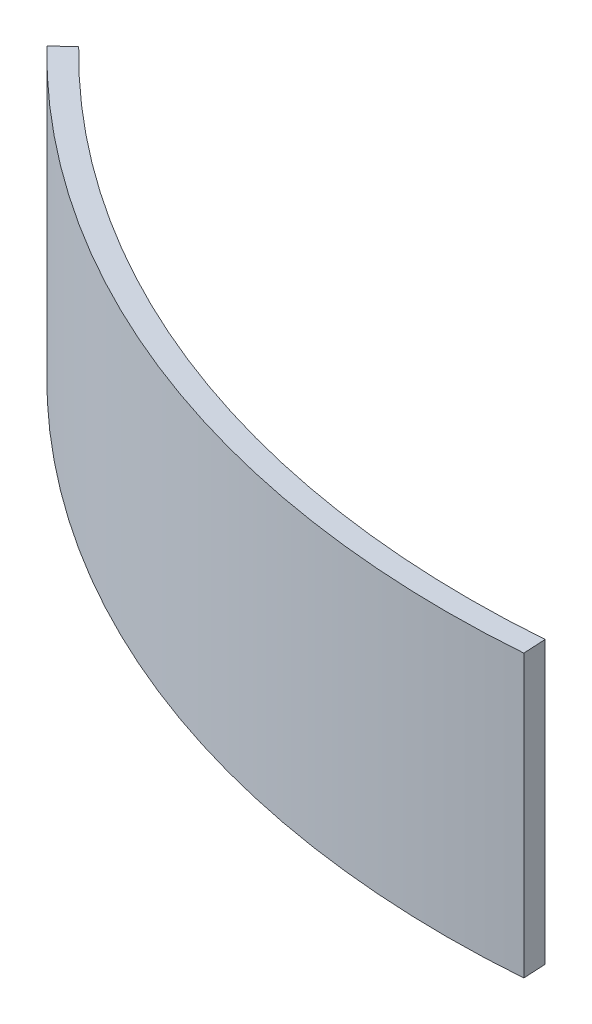
ISO-10303-21;
HEADER;
FILE_DESCRIPTION(('STEP AP214'),'2;1');
FILE_NAME('part.step','',(''),(''),'','','');
FILE_SCHEMA(('AUTOMOTIVE_DESIGN { 1 0 10303 214 1 1 1 1 }'));
ENDSEC;
DATA;
#1=APPLICATION_CONTEXT('core data for automotive mechanical design processes');
#2=APPLICATION_PROTOCOL_DEFINITION('international standard','automotive_design',2000,#1);
#3=PRODUCT_CONTEXT('',#1,'mechanical');
#4=PRODUCT('Part','Part','',(#3));
#5=PRODUCT_RELATED_PRODUCT_CATEGORY('part','',(#4));
#6=PRODUCT_DEFINITION_FORMATION('','',#4);
#7=PRODUCT_DEFINITION_CONTEXT('part definition',#1,'design');
#8=PRODUCT_DEFINITION('design','',#6,#7);
#9=PRODUCT_DEFINITION_SHAPE('','',#8);
#10=(LENGTH_UNIT() NAMED_UNIT(*) SI_UNIT(.MILLI.,.METRE.));
#11=(NAMED_UNIT(*) PLANE_ANGLE_UNIT() SI_UNIT($,.RADIAN.));
#12=(NAMED_UNIT(*) SI_UNIT($,.STERADIAN.) SOLID_ANGLE_UNIT());
#13=UNCERTAINTY_MEASURE_WITH_UNIT(LENGTH_MEASURE(1.E-05),#10,'distance_accuracy_value','');
#14=(GEOMETRIC_REPRESENTATION_CONTEXT(3) GLOBAL_UNCERTAINTY_ASSIGNED_CONTEXT((#13)) GLOBAL_UNIT_ASSIGNED_CONTEXT((#10,
#11,#12)) REPRESENTATION_CONTEXT('',''));
#15=CARTESIAN_POINT('',(0.,0.,0.));
#16=DIRECTION('',(0.,0.,1.));
#17=DIRECTION('',(1.,0.,0.));
#18=AXIS2_PLACEMENT_3D('',#15,#16,#17);
#19=CARTESIAN_POINT('',(4.62050479890785,0.,-0.230351268787765));
#20=DIRECTION('',(0.998547212890272,0.,-0.0538837974633326));
#21=DIRECTION('',(-0.0538837974633327,0.,-0.998547212890272));
#22=AXIS2_PLACEMENT_3D('',#19,#20,#21);
#23=PLANE('',#22);
#24=DIRECTION('',(0.,-1.,0.));
#25=VECTOR('',#24,1.);
#26=CARTESIAN_POINT('',(4.62050479890785,0.,-0.230351268787765));
#27=LINE('',#26,#25);
#28=CARTESIAN_POINT('',(4.62050479890786,0.,-0.230351268787762));
#29=VERTEX_POINT('',#28);
#30=CARTESIAN_POINT('',(4.62050479890786,-25.,-0.230351268787771));
#31=VERTEX_POINT('',#30);
#32=EDGE_CURVE('E95',#29,#31,#27,.T.);
#33=ORIENTED_EDGE('',*,*,#32,.T.);
#34=DIRECTION('',(-0.0538837974633327,0.,-0.998547212890272));
#35=VECTOR('',#34,1.);
#36=CARTESIAN_POINT('',(4.62050479890785,-25.,-0.230351268787768));
#37=LINE('',#36,#35);
#38=CARTESIAN_POINT('',(4.51273720398119,-25.,-2.22744569456831));
#39=VERTEX_POINT('',#38);
#40=EDGE_CURVE('E88',#31,#39,#37,.T.);
#41=ORIENTED_EDGE('',*,*,#40,.T.);
#42=DIRECTION('',(0.,1.,0.));
#43=VECTOR('',#42,1.);
#44=CARTESIAN_POINT('',(4.51273720398119,0.,-2.22744569456831));
#45=LINE('',#44,#43);
#46=CARTESIAN_POINT('',(4.51273720398119,0.,-2.22744569456831));
#47=VERTEX_POINT('',#46);
#48=EDGE_CURVE('E83',#39,#47,#45,.T.);
#49=ORIENTED_EDGE('',*,*,#48,.T.);
#50=DIRECTION('',(0.0538837974633327,0.,0.998547212890272));
#51=VECTOR('',#50,1.);
#52=CARTESIAN_POINT('',(4.62050479890785,0.,-0.230351268787765));
#53=LINE('',#52,#51);
#54=EDGE_CURVE('E78',#47,#29,#53,.T.);
#55=ORIENTED_EDGE('',*,*,#54,.T.);
#56=EDGE_LOOP('',(#33,#41,#49,#55));
#57=FACE_BOUND('',#56,.T.);
#58=ADVANCED_FACE('F43',(#57),#23,.T.);
#59=CARTESIAN_POINT('',(-63.2826344155405,0.,-25.7555279200355));
#60=DIRECTION('',(0.683131159753826,0.,0.730295706254249));
#61=DIRECTION('',(0.730295706254249,0.,-0.683131159753826));
#62=AXIS2_PLACEMENT_3D('',#59,#60,#61);
#63=PLANE('',#62);
#64=DIRECTION('',(0.,-1.,0.));
#65=VECTOR('',#64,1.);
#66=CARTESIAN_POINT('',(-63.2826344155405,0.,-25.7555279200355));
#67=LINE('',#66,#65);
#68=CARTESIAN_POINT('',(-63.2826344155405,0.,-25.7555279200355));
#69=VERTEX_POINT('',#68);
#70=CARTESIAN_POINT('',(-63.2826344155405,-25.,-25.7555279200355));
#71=VERTEX_POINT('',#70);
#72=EDGE_CURVE('E116',#69,#71,#67,.T.);
#73=ORIENTED_EDGE('',*,*,#72,.F.);
#74=DIRECTION('',(-0.730295706254249,0.,0.683131159753826));
#75=VECTOR('',#74,1.);
#76=CARTESIAN_POINT('',(-63.2826344155405,0.,-25.7555279200355));
#77=LINE('',#76,#75);
#78=CARTESIAN_POINT('',(-61.8220430030321,0.,-27.1217902395432));
#79=VERTEX_POINT('',#78);
#80=EDGE_CURVE('E11',#79,#69,#77,.T.);
#81=ORIENTED_EDGE('',*,*,#80,.F.);
#82=DIRECTION('',(0.,1.,0.));
#83=VECTOR('',#82,1.);
#84=CARTESIAN_POINT('',(-61.8220430030321,0.,-27.1217902395432));
#85=LINE('',#84,#83);
#86=CARTESIAN_POINT('',(-61.8220430030321,-25.,-27.1217902395432));
#87=VERTEX_POINT('',#86);
#88=EDGE_CURVE('E51',#87,#79,#85,.T.);
#89=ORIENTED_EDGE('',*,*,#88,.F.);
#90=DIRECTION('',(0.730295706254249,0.,-0.683131159753826));
#91=VECTOR('',#90,1.);
#92=CARTESIAN_POINT('',(-63.2826344155405,-25.,-25.7555279200355));
#93=LINE('',#92,#91);
#94=EDGE_CURVE('E66',#71,#87,#93,.T.);
#95=ORIENTED_EDGE('',*,*,#94,.F.);
#96=EDGE_LOOP('',(#73,#81,#89,#95));
#97=FACE_BOUND('',#96,.T.);
#98=ADVANCED_FACE('F127',(#97),#63,.F.);
#99=CARTESIAN_POINT('',(-1.96160582040153,0.,-85.8023155792657));
#100=DIRECTION('',(0.,-1.,0.));
#101=DIRECTION('',(0.,0.,-1.));
#102=AXIS2_PLACEMENT_3D('',#99,#100,#101);
#103=CYLINDRICAL_SURFACE('',#102,85.8247356894184);
#104=CARTESIAN_POINT('',(-1.96160582040153,-25.,-85.8023155792657));
#105=DIRECTION('',(0.,-1.,0.));
#106=DIRECTION('',(0.0766924659474473,0.,0.997054795719322));
#107=AXIS2_PLACEMENT_3D('',#104,#105,#106);
#108=CIRCLE('',#107,85.8247356894184);
#109=EDGE_CURVE('E98',#31,#71,#108,.T.);
#110=ORIENTED_EDGE('',*,*,#109,.F.);
#111=ORIENTED_EDGE('',*,*,#32,.F.);
#112=CARTESIAN_POINT('',(-1.96160582040153,0.,-85.8023155792657));
#113=DIRECTION('',(0.,-1.,0.));
#114=DIRECTION('',(0.0766924659474473,0.,0.997054795719322));
#115=AXIS2_PLACEMENT_3D('',#112,#113,#114);
#116=CIRCLE('',#115,85.8247356894184);
#117=EDGE_CURVE('E97',#29,#69,#116,.T.);
#118=ORIENTED_EDGE('',*,*,#117,.T.);
#119=ORIENTED_EDGE('',*,*,#72,.T.);
#120=EDGE_LOOP('',(#110,#111,#118,#119));
#121=FACE_BOUND('',#120,.T.);
#122=ADVANCED_FACE('F96',(#121),#103,.T.);
#123=CARTESIAN_POINT('',(4.62050479890785,-25.,-0.230351268787768));
#124=DIRECTION('',(0.,1.,0.));
#125=DIRECTION('',(0.,0.,1.));
#126=AXIS2_PLACEMENT_3D('',#123,#124,#125);
#127=PLANE('',#126);
#128=CARTESIAN_POINT('',(-1.96160582040153,-25.,-85.8023155792657));
#129=DIRECTION('',(0.,-1.,0.));
#130=DIRECTION('',(0.0772361720613266,0.,0.997012825256181));
#131=AXIS2_PLACEMENT_3D('',#128,#129,#130);
#132=CIRCLE('',#131,83.8252706159752);
#133=EDGE_CURVE('E108',#39,#87,#132,.T.);
#134=ORIENTED_EDGE('',*,*,#133,.F.);
#135=ORIENTED_EDGE('',*,*,#40,.F.);
#136=ORIENTED_EDGE('',*,*,#109,.T.);
#137=ORIENTED_EDGE('',*,*,#94,.T.);
#138=EDGE_LOOP('',(#134,#135,#136,#137));
#139=FACE_BOUND('',#138,.T.);
#140=ADVANCED_FACE('F128',(#139),#127,.F.);
#141=CARTESIAN_POINT('',(-1.96160582040153,0.,-85.8023155792657));
#142=DIRECTION('',(0.,-1.,0.));
#143=DIRECTION('',(0.,0.,-1.));
#144=AXIS2_PLACEMENT_3D('',#141,#142,#143);
#145=CYLINDRICAL_SURFACE('',#144,83.8252706159752);
#146=CARTESIAN_POINT('',(-1.96160582040153,0.,-85.8023155792657));
#147=DIRECTION('',(0.,-1.,0.));
#148=DIRECTION('',(0.0772361720613266,0.,0.997012825256181));
#149=AXIS2_PLACEMENT_3D('',#146,#147,#148);
#150=CIRCLE('',#149,83.8252706159752);
#151=EDGE_CURVE('E119',#47,#79,#150,.T.);
#152=ORIENTED_EDGE('',*,*,#151,.F.);
#153=ORIENTED_EDGE('',*,*,#48,.F.);
#154=ORIENTED_EDGE('',*,*,#133,.T.);
#155=ORIENTED_EDGE('',*,*,#88,.T.);
#156=EDGE_LOOP('',(#152,#153,#154,#155));
#157=FACE_BOUND('',#156,.T.);
#158=ADVANCED_FACE('F130',(#157),#145,.F.);
#159=CARTESIAN_POINT('',(4.62050479890785,0.,-0.230351268787765));
#160=DIRECTION('',(0.,-1.,0.));
#161=DIRECTION('',(0.,0.,-1.));
#162=AXIS2_PLACEMENT_3D('',#159,#160,#161);
#163=PLANE('',#162);
#164=ORIENTED_EDGE('',*,*,#80,.T.);
#165=ORIENTED_EDGE('',*,*,#117,.F.);
#166=ORIENTED_EDGE('',*,*,#54,.F.);
#167=ORIENTED_EDGE('',*,*,#151,.T.);
#168=EDGE_LOOP('',(#164,#165,#166,#167));
#169=FACE_BOUND('',#168,.T.);
#170=ADVANCED_FACE('F103',(#169),#163,.F.);
#171=CLOSED_SHELL('',(#58,#98,#122,#140,#158,#170));
#172=MANIFOLD_SOLID_BREP('B2',#171);
#173=ADVANCED_BREP_SHAPE_REPRESENTATION('',(#18,#172),#14);
#174=SHAPE_DEFINITION_REPRESENTATION(#9,#173);
ENDSEC;
END-ISO-10303-21;
